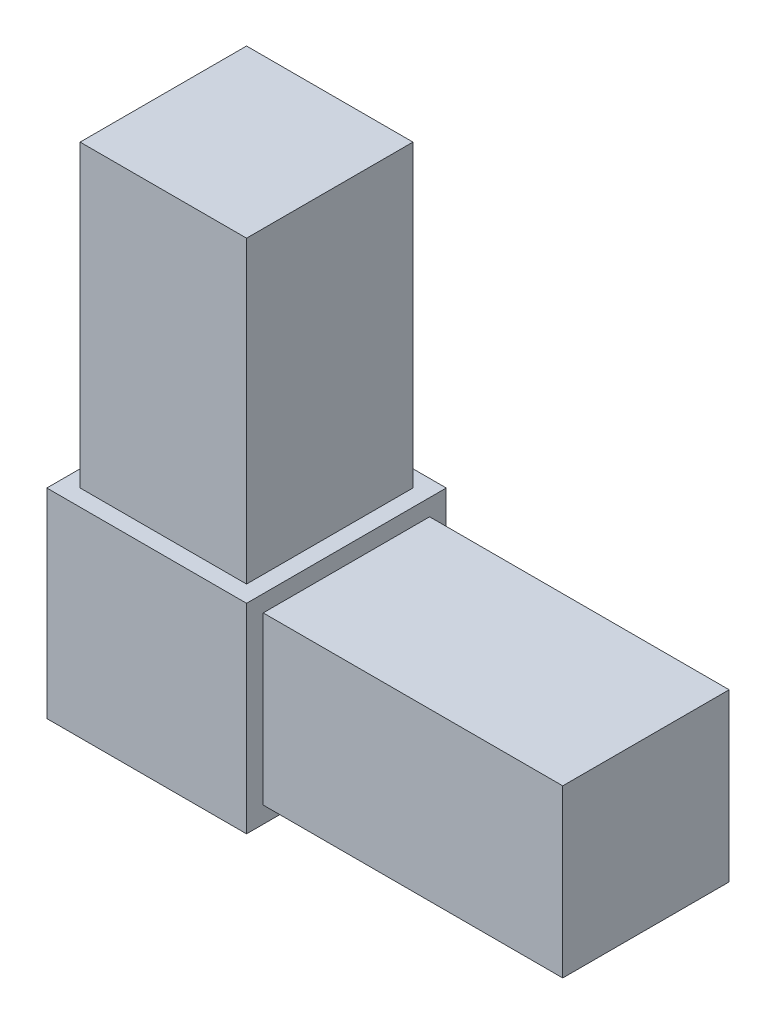
ISO-10303-21;
HEADER;
FILE_DESCRIPTION(('STEP AP214'),'2;1');
FILE_NAME('part.step','',(''),(''),'','','');
FILE_SCHEMA(('AUTOMOTIVE_DESIGN { 1 0 10303 214 1 1 1 1 }'));
ENDSEC;
DATA;
#1=APPLICATION_CONTEXT('core data for automotive mechanical design processes');
#2=APPLICATION_PROTOCOL_DEFINITION('international standard','automotive_design',2000,#1);
#3=PRODUCT_CONTEXT('',#1,'mechanical');
#4=PRODUCT('Part','Part','',(#3));
#5=PRODUCT_RELATED_PRODUCT_CATEGORY('part','',(#4));
#6=PRODUCT_DEFINITION_FORMATION('','',#4);
#7=PRODUCT_DEFINITION_CONTEXT('part definition',#1,'design');
#8=PRODUCT_DEFINITION('design','',#6,#7);
#9=PRODUCT_DEFINITION_SHAPE('','',#8);
#10=(LENGTH_UNIT() NAMED_UNIT(*) SI_UNIT(.MILLI.,.METRE.));
#11=(NAMED_UNIT(*) PLANE_ANGLE_UNIT() SI_UNIT($,.RADIAN.));
#12=(NAMED_UNIT(*) SI_UNIT($,.STERADIAN.) SOLID_ANGLE_UNIT());
#13=UNCERTAINTY_MEASURE_WITH_UNIT(LENGTH_MEASURE(1.E-05),#10,'distance_accuracy_value','');
#14=(GEOMETRIC_REPRESENTATION_CONTEXT(3) GLOBAL_UNCERTAINTY_ASSIGNED_CONTEXT((#13)) GLOBAL_UNIT_ASSIGNED_CONTEXT((#10,
#11,#12)) REPRESENTATION_CONTEXT('',''));
#15=CARTESIAN_POINT('',(0.,0.,0.));
#16=DIRECTION('',(0.,0.,1.));
#17=DIRECTION('',(1.,0.,0.));
#18=AXIS2_PLACEMENT_3D('',#15,#16,#17);
#19=CARTESIAN_POINT('',(9.525,-9.525,19.05));
#20=DIRECTION('',(-1.,0.,0.));
#21=DIRECTION('',(0.,0.,1.));
#22=AXIS2_PLACEMENT_3D('',#19,#20,#21);
#23=PLANE('',#22);
#24=DIRECTION('',(0.,1.,0.));
#25=VECTOR('',#24,1.);
#26=CARTESIAN_POINT('',(9.525,-9.525,0.));
#27=LINE('',#26,#25);
#28=CARTESIAN_POINT('',(9.525,-9.525,0.));
#29=VERTEX_POINT('',#28);
#30=CARTESIAN_POINT('',(9.525,9.525,0.));
#31=VERTEX_POINT('',#30);
#32=EDGE_CURVE('E198',#29,#31,#27,.T.);
#33=ORIENTED_EDGE('',*,*,#32,.T.);
#34=DIRECTION('',(0.,0.,-1.));
#35=VECTOR('',#34,1.);
#36=CARTESIAN_POINT('',(9.525,9.525,19.05));
#37=LINE('',#36,#35);
#38=CARTESIAN_POINT('',(9.525,9.525,19.05));
#39=VERTEX_POINT('',#38);
#40=EDGE_CURVE('E203',#39,#31,#37,.T.);
#41=ORIENTED_EDGE('',*,*,#40,.F.);
#42=DIRECTION('',(0.,1.,0.));
#43=VECTOR('',#42,1.);
#44=CARTESIAN_POINT('',(9.525,-9.525,19.05));
#45=LINE('',#44,#43);
#46=CARTESIAN_POINT('',(9.525,-9.525,19.05));
#47=VERTEX_POINT('',#46);
#48=EDGE_CURVE('E189',#47,#39,#45,.T.);
#49=ORIENTED_EDGE('',*,*,#48,.F.);
#50=DIRECTION('',(0.,0.,-1.));
#51=VECTOR('',#50,1.);
#52=CARTESIAN_POINT('',(9.525,-9.525,19.05));
#53=LINE('',#52,#51);
#54=EDGE_CURVE('E42',#47,#29,#53,.T.);
#55=ORIENTED_EDGE('',*,*,#54,.T.);
#56=EDGE_LOOP('',(#33,#41,#49,#55));
#57=FACE_BOUND('',#56,.T.);
#58=DIRECTION('',(0.,1.,0.));
#59=VECTOR('',#58,1.);
#60=CARTESIAN_POINT('',(9.525,-7.9375,1.5875));
#61=LINE('',#60,#59);
#62=CARTESIAN_POINT('',(9.525,-7.9375,1.5875));
#63=VERTEX_POINT('',#62);
#64=CARTESIAN_POINT('',(9.525,7.9375,1.5875));
#65=VERTEX_POINT('',#64);
#66=EDGE_CURVE('E143',#63,#65,#61,.T.);
#67=ORIENTED_EDGE('',*,*,#66,.F.);
#68=DIRECTION('',(0.,0.,-1.));
#69=VECTOR('',#68,1.);
#70=CARTESIAN_POINT('',(9.525,-7.9375,17.4625));
#71=LINE('',#70,#69);
#72=CARTESIAN_POINT('',(9.525,-7.9375,17.4625));
#73=VERTEX_POINT('',#72);
#74=EDGE_CURVE('E140',#73,#63,#71,.T.);
#75=ORIENTED_EDGE('',*,*,#74,.F.);
#76=DIRECTION('',(0.,-1.,0.));
#77=VECTOR('',#76,1.);
#78=CARTESIAN_POINT('',(9.525,-7.9375,17.4625));
#79=LINE('',#78,#77);
#80=CARTESIAN_POINT('',(9.525,7.9375,17.4625));
#81=VERTEX_POINT('',#80);
#82=EDGE_CURVE('E54',#81,#73,#79,.T.);
#83=ORIENTED_EDGE('',*,*,#82,.F.);
#84=DIRECTION('',(0.,0.,1.));
#85=VECTOR('',#84,1.);
#86=CARTESIAN_POINT('',(9.525,7.9375,17.4625));
#87=LINE('',#86,#85);
#88=EDGE_CURVE('E49',#65,#81,#87,.T.);
#89=ORIENTED_EDGE('',*,*,#88,.F.);
#90=EDGE_LOOP('',(#67,#75,#83,#89));
#91=FACE_BOUND('',#90,.T.);
#92=ADVANCED_FACE('F34',(#57,#91),#23,.F.);
#93=CARTESIAN_POINT('',(9.525,9.525,19.05));
#94=DIRECTION('',(0.,-1.,0.));
#95=DIRECTION('',(1.,0.,0.));
#96=AXIS2_PLACEMENT_3D('',#93,#94,#95);
#97=PLANE('',#96);
#98=DIRECTION('',(-1.,0.,0.));
#99=VECTOR('',#98,1.);
#100=CARTESIAN_POINT('',(9.525,9.525,0.));
#101=LINE('',#100,#99);
#102=CARTESIAN_POINT('',(-9.525,9.525,0.));
#103=VERTEX_POINT('',#102);
#104=EDGE_CURVE('E187',#31,#103,#101,.T.);
#105=ORIENTED_EDGE('',*,*,#104,.T.);
#106=DIRECTION('',(0.,0.,-1.));
#107=VECTOR('',#106,1.);
#108=CARTESIAN_POINT('',(-9.525,9.525,19.05));
#109=LINE('',#108,#107);
#110=CARTESIAN_POINT('',(-9.525,9.525,19.05));
#111=VERTEX_POINT('',#110);
#112=EDGE_CURVE('E193',#111,#103,#109,.T.);
#113=ORIENTED_EDGE('',*,*,#112,.F.);
#114=DIRECTION('',(-1.,0.,0.));
#115=VECTOR('',#114,1.);
#116=CARTESIAN_POINT('',(9.525,9.525,19.05));
#117=LINE('',#116,#115);
#118=EDGE_CURVE('E191',#39,#111,#117,.T.);
#119=ORIENTED_EDGE('',*,*,#118,.F.);
#120=ORIENTED_EDGE('',*,*,#40,.T.);
#121=EDGE_LOOP('',(#105,#113,#119,#120));
#122=FACE_BOUND('',#121,.T.);
#123=DIRECTION('',(0.,0.,-1.));
#124=VECTOR('',#123,1.);
#125=CARTESIAN_POINT('',(7.9375,9.525,1.5875));
#126=LINE('',#125,#124);
#127=CARTESIAN_POINT('',(7.9375,9.525,17.4625));
#128=VERTEX_POINT('',#127);
#129=CARTESIAN_POINT('',(7.9375,9.525,1.5875));
#130=VERTEX_POINT('',#129);
#131=EDGE_CURVE('E144',#128,#130,#126,.T.);
#132=ORIENTED_EDGE('',*,*,#131,.F.);
#133=DIRECTION('',(1.,0.,0.));
#134=VECTOR('',#133,1.);
#135=CARTESIAN_POINT('',(-7.9375,9.525,17.4625));
#136=LINE('',#135,#134);
#137=CARTESIAN_POINT('',(-7.9375,9.525,17.4625));
#138=VERTEX_POINT('',#137);
#139=EDGE_CURVE('E157',#138,#128,#136,.T.);
#140=ORIENTED_EDGE('',*,*,#139,.F.);
#141=DIRECTION('',(0.,0.,1.));
#142=VECTOR('',#141,1.);
#143=CARTESIAN_POINT('',(-7.9375,9.525,1.5875));
#144=LINE('',#143,#142);
#145=CARTESIAN_POINT('',(-7.9375,9.525,1.58750000000001));
#146=VERTEX_POINT('',#145);
#147=EDGE_CURVE('E166',#146,#138,#144,.T.);
#148=ORIENTED_EDGE('',*,*,#147,.F.);
#149=DIRECTION('',(-1.,0.,0.));
#150=VECTOR('',#149,1.);
#151=CARTESIAN_POINT('',(-7.9375,9.525,1.5875));
#152=LINE('',#151,#150);
#153=EDGE_CURVE('E147',#130,#146,#152,.T.);
#154=ORIENTED_EDGE('',*,*,#153,.F.);
#155=EDGE_LOOP('',(#132,#140,#148,#154));
#156=FACE_BOUND('',#155,.T.);
#157=ADVANCED_FACE('F218',(#122,#156),#97,.F.);
#158=CARTESIAN_POINT('',(-9.525,-9.525,19.05));
#159=DIRECTION('',(1.,0.,0.));
#160=DIRECTION('',(0.,0.,-1.));
#161=AXIS2_PLACEMENT_3D('',#158,#159,#160);
#162=PLANE('',#161);
#163=DIRECTION('',(0.,-1.,0.));
#164=VECTOR('',#163,1.);
#165=CARTESIAN_POINT('',(-9.525,-9.525,0.));
#166=LINE('',#165,#164);
#167=CARTESIAN_POINT('',(-9.525,-9.525,0.));
#168=VERTEX_POINT('',#167);
#169=EDGE_CURVE('E182',#103,#168,#166,.T.);
#170=ORIENTED_EDGE('',*,*,#169,.T.);
#171=DIRECTION('',(0.,0.,-1.));
#172=VECTOR('',#171,1.);
#173=CARTESIAN_POINT('',(-9.525,-9.525,19.05));
#174=LINE('',#173,#172);
#175=CARTESIAN_POINT('',(-9.525,-9.525,19.05));
#176=VERTEX_POINT('',#175);
#177=EDGE_CURVE('E11',#176,#168,#174,.T.);
#178=ORIENTED_EDGE('',*,*,#177,.F.);
#179=DIRECTION('',(0.,-1.,0.));
#180=VECTOR('',#179,1.);
#181=CARTESIAN_POINT('',(-9.525,-9.525,19.05));
#182=LINE('',#181,#180);
#183=EDGE_CURVE('E183',#111,#176,#182,.T.);
#184=ORIENTED_EDGE('',*,*,#183,.F.);
#185=ORIENTED_EDGE('',*,*,#112,.T.);
#186=EDGE_LOOP('',(#170,#178,#184,#185));
#187=FACE_BOUND('',#186,.T.);
#188=ADVANCED_FACE('F36',(#187),#162,.F.);
#189=CARTESIAN_POINT('',(9.525,-9.525,19.05));
#190=DIRECTION('',(0.,1.,0.));
#191=DIRECTION('',(-1.,0.,0.));
#192=AXIS2_PLACEMENT_3D('',#189,#190,#191);
#193=PLANE('',#192);
#194=DIRECTION('',(1.,0.,0.));
#195=VECTOR('',#194,1.);
#196=CARTESIAN_POINT('',(9.525,-9.525,0.));
#197=LINE('',#196,#195);
#198=EDGE_CURVE('E196',#168,#29,#197,.T.);
#199=ORIENTED_EDGE('',*,*,#198,.T.);
#200=ORIENTED_EDGE('',*,*,#54,.F.);
#201=DIRECTION('',(1.,0.,0.));
#202=VECTOR('',#201,1.);
#203=CARTESIAN_POINT('',(9.525,-9.525,19.05));
#204=LINE('',#203,#202);
#205=EDGE_CURVE('E186',#176,#47,#204,.T.);
#206=ORIENTED_EDGE('',*,*,#205,.F.);
#207=ORIENTED_EDGE('',*,*,#177,.T.);
#208=EDGE_LOOP('',(#199,#200,#206,#207));
#209=FACE_BOUND('',#208,.T.);
#210=ADVANCED_FACE('F226',(#209),#193,.F.);
#211=CARTESIAN_POINT('',(0.,0.,19.05));
#212=DIRECTION('',(0.,0.,1.));
#213=DIRECTION('',(1.,0.,0.));
#214=AXIS2_PLACEMENT_3D('',#211,#212,#213);
#215=PLANE('',#214);
#216=ORIENTED_EDGE('',*,*,#183,.T.);
#217=ORIENTED_EDGE('',*,*,#205,.T.);
#218=ORIENTED_EDGE('',*,*,#48,.T.);
#219=ORIENTED_EDGE('',*,*,#118,.T.);
#220=EDGE_LOOP('',(#216,#217,#218,#219));
#221=FACE_BOUND('',#220,.T.);
#222=ADVANCED_FACE('F225',(#221),#215,.T.);
#223=CARTESIAN_POINT('',(0.,0.,0.));
#224=DIRECTION('',(0.,0.,1.));
#225=DIRECTION('',(1.,0.,0.));
#226=AXIS2_PLACEMENT_3D('',#223,#224,#225);
#227=PLANE('',#226);
#228=ORIENTED_EDGE('',*,*,#169,.F.);
#229=ORIENTED_EDGE('',*,*,#104,.F.);
#230=ORIENTED_EDGE('',*,*,#32,.F.);
#231=ORIENTED_EDGE('',*,*,#198,.F.);
#232=EDGE_LOOP('',(#228,#229,#230,#231));
#233=FACE_BOUND('',#232,.T.);
#234=ADVANCED_FACE('F215',(#233),#227,.F.);
#235=CARTESIAN_POINT('',(7.9375,38.1,1.5875));
#236=DIRECTION('',(-1.,0.,0.));
#237=DIRECTION('',(0.,0.,1.));
#238=AXIS2_PLACEMENT_3D('',#235,#236,#237);
#239=PLANE('',#238);
#240=ORIENTED_EDGE('',*,*,#131,.T.);
#241=DIRECTION('',(0.,-1.,0.));
#242=VECTOR('',#241,1.);
#243=CARTESIAN_POINT('',(7.9375,38.1,1.5875));
#244=LINE('',#243,#242);
#245=CARTESIAN_POINT('',(7.9375,38.1,1.5875));
#246=VERTEX_POINT('',#245);
#247=EDGE_CURVE('E179',#246,#130,#244,.T.);
#248=ORIENTED_EDGE('',*,*,#247,.F.);
#249=DIRECTION('',(0.,0.,-1.));
#250=VECTOR('',#249,1.);
#251=CARTESIAN_POINT('',(7.9375,38.1,1.5875));
#252=LINE('',#251,#250);
#253=CARTESIAN_POINT('',(7.9375,38.1,17.4625));
#254=VERTEX_POINT('',#253);
#255=EDGE_CURVE('E153',#254,#246,#252,.T.);
#256=ORIENTED_EDGE('',*,*,#255,.F.);
#257=DIRECTION('',(0.,-1.,0.));
#258=VECTOR('',#257,1.);
#259=CARTESIAN_POINT('',(7.9375,38.1,17.4625));
#260=LINE('',#259,#258);
#261=EDGE_CURVE('E162',#254,#128,#260,.T.);
#262=ORIENTED_EDGE('',*,*,#261,.T.);
#263=EDGE_LOOP('',(#240,#248,#256,#262));
#264=FACE_BOUND('',#263,.T.);
#265=ADVANCED_FACE('F241',(#264),#239,.F.);
#266=CARTESIAN_POINT('',(-7.9375,38.1,1.5875));
#267=DIRECTION('',(0.,0.,1.));
#268=DIRECTION('',(1.,0.,0.));
#269=AXIS2_PLACEMENT_3D('',#266,#267,#268);
#270=PLANE('',#269);
#271=ORIENTED_EDGE('',*,*,#153,.T.);
#272=DIRECTION('',(0.,-1.,0.));
#273=VECTOR('',#272,1.);
#274=CARTESIAN_POINT('',(-7.9375,38.1,1.5875));
#275=LINE('',#274,#273);
#276=CARTESIAN_POINT('',(-7.9375,38.1,1.5875));
#277=VERTEX_POINT('',#276);
#278=EDGE_CURVE('E176',#277,#146,#275,.T.);
#279=ORIENTED_EDGE('',*,*,#278,.F.);
#280=DIRECTION('',(-1.,0.,0.));
#281=VECTOR('',#280,1.);
#282=CARTESIAN_POINT('',(-7.9375,38.1,1.5875));
#283=LINE('',#282,#281);
#284=EDGE_CURVE('E156',#246,#277,#283,.T.);
#285=ORIENTED_EDGE('',*,*,#284,.F.);
#286=ORIENTED_EDGE('',*,*,#247,.T.);
#287=EDGE_LOOP('',(#271,#279,#285,#286));
#288=FACE_BOUND('',#287,.T.);
#289=ADVANCED_FACE('F245',(#288),#270,.F.);
#290=CARTESIAN_POINT('',(-7.9375,38.1,1.5875));
#291=DIRECTION('',(1.,0.,0.));
#292=DIRECTION('',(0.,0.,-1.));
#293=AXIS2_PLACEMENT_3D('',#290,#291,#292);
#294=PLANE('',#293);
#295=ORIENTED_EDGE('',*,*,#147,.T.);
#296=DIRECTION('',(0.,-1.,0.));
#297=VECTOR('',#296,1.);
#298=CARTESIAN_POINT('',(-7.9375,38.1,17.4625));
#299=LINE('',#298,#297);
#300=CARTESIAN_POINT('',(-7.9375,38.1,17.4625));
#301=VERTEX_POINT('',#300);
#302=EDGE_CURVE('E173',#301,#138,#299,.T.);
#303=ORIENTED_EDGE('',*,*,#302,.F.);
#304=DIRECTION('',(0.,0.,1.));
#305=VECTOR('',#304,1.);
#306=CARTESIAN_POINT('',(-7.9375,38.1,1.5875));
#307=LINE('',#306,#305);
#308=EDGE_CURVE('E159',#277,#301,#307,.T.);
#309=ORIENTED_EDGE('',*,*,#308,.F.);
#310=ORIENTED_EDGE('',*,*,#278,.T.);
#311=EDGE_LOOP('',(#295,#303,#309,#310));
#312=FACE_BOUND('',#311,.T.);
#313=ADVANCED_FACE('F249',(#312),#294,.F.);
#314=CARTESIAN_POINT('',(-7.9375,38.1,17.4625));
#315=DIRECTION('',(0.,0.,-1.));
#316=DIRECTION('',(-1.,0.,0.));
#317=AXIS2_PLACEMENT_3D('',#314,#315,#316);
#318=PLANE('',#317);
#319=ORIENTED_EDGE('',*,*,#139,.T.);
#320=ORIENTED_EDGE('',*,*,#261,.F.);
#321=DIRECTION('',(1.,0.,0.));
#322=VECTOR('',#321,1.);
#323=CARTESIAN_POINT('',(-7.9375,38.1,17.4625));
#324=LINE('',#323,#322);
#325=EDGE_CURVE('E161',#301,#254,#324,.T.);
#326=ORIENTED_EDGE('',*,*,#325,.F.);
#327=ORIENTED_EDGE('',*,*,#302,.T.);
#328=EDGE_LOOP('',(#319,#320,#326,#327));
#329=FACE_BOUND('',#328,.T.);
#330=ADVANCED_FACE('F253',(#329),#318,.F.);
#331=CARTESIAN_POINT('',(0.,38.1,0.));
#332=DIRECTION('',(0.,1.,0.));
#333=DIRECTION('',(0.,0.,1.));
#334=AXIS2_PLACEMENT_3D('',#331,#332,#333);
#335=PLANE('',#334);
#336=ORIENTED_EDGE('',*,*,#255,.T.);
#337=ORIENTED_EDGE('',*,*,#284,.T.);
#338=ORIENTED_EDGE('',*,*,#308,.T.);
#339=ORIENTED_EDGE('',*,*,#325,.T.);
#340=EDGE_LOOP('',(#336,#337,#338,#339));
#341=FACE_BOUND('',#340,.T.);
#342=ADVANCED_FACE('F257',(#341),#335,.T.);
#343=CARTESIAN_POINT('',(38.1,-7.9375,1.5875));
#344=DIRECTION('',(0.,0.,1.));
#345=DIRECTION('',(1.,0.,0.));
#346=AXIS2_PLACEMENT_3D('',#343,#344,#345);
#347=PLANE('',#346);
#348=ORIENTED_EDGE('',*,*,#66,.T.);
#349=DIRECTION('',(-1.,0.,0.));
#350=VECTOR('',#349,1.);
#351=CARTESIAN_POINT('',(38.1,7.9375,1.5875));
#352=LINE('',#351,#350);
#353=CARTESIAN_POINT('',(38.1,7.9375,1.5875));
#354=VERTEX_POINT('',#353);
#355=EDGE_CURVE('E124',#354,#65,#352,.T.);
#356=ORIENTED_EDGE('',*,*,#355,.F.);
#357=DIRECTION('',(0.,1.,0.));
#358=VECTOR('',#357,1.);
#359=CARTESIAN_POINT('',(38.1,-7.9375,1.5875));
#360=LINE('',#359,#358);
#361=CARTESIAN_POINT('',(38.1,-7.9375,1.5875));
#362=VERTEX_POINT('',#361);
#363=EDGE_CURVE('E131',#362,#354,#360,.T.);
#364=ORIENTED_EDGE('',*,*,#363,.F.);
#365=DIRECTION('',(-1.,0.,0.));
#366=VECTOR('',#365,1.);
#367=CARTESIAN_POINT('',(38.1,-7.9375,1.5875));
#368=LINE('',#367,#366);
#369=EDGE_CURVE('E369',#362,#63,#368,.T.);
#370=ORIENTED_EDGE('',*,*,#369,.T.);
#371=EDGE_LOOP('',(#348,#356,#364,#370));
#372=FACE_BOUND('',#371,.T.);
#373=ADVANCED_FACE('F142',(#372),#347,.F.);
#374=CARTESIAN_POINT('',(38.1,7.9375,17.4625));
#375=DIRECTION('',(0.,-1.,0.));
#376=DIRECTION('',(0.,0.,-1.));
#377=AXIS2_PLACEMENT_3D('',#374,#375,#376);
#378=PLANE('',#377);
#379=ORIENTED_EDGE('',*,*,#88,.T.);
#380=DIRECTION('',(-1.,0.,0.));
#381=VECTOR('',#380,1.);
#382=CARTESIAN_POINT('',(38.1,7.9375,17.4625));
#383=LINE('',#382,#381);
#384=CARTESIAN_POINT('',(38.1,7.9375,17.4625));
#385=VERTEX_POINT('',#384);
#386=EDGE_CURVE('E127',#385,#81,#383,.T.);
#387=ORIENTED_EDGE('',*,*,#386,.F.);
#388=DIRECTION('',(0.,0.,1.));
#389=VECTOR('',#388,1.);
#390=CARTESIAN_POINT('',(38.1,7.9375,17.4625));
#391=LINE('',#390,#389);
#392=EDGE_CURVE('E120',#354,#385,#391,.T.);
#393=ORIENTED_EDGE('',*,*,#392,.F.);
#394=ORIENTED_EDGE('',*,*,#355,.T.);
#395=EDGE_LOOP('',(#379,#387,#393,#394));
#396=FACE_BOUND('',#395,.T.);
#397=ADVANCED_FACE('F122',(#396),#378,.F.);
#398=CARTESIAN_POINT('',(38.1,-7.9375,17.4625));
#399=DIRECTION('',(0.,0.,-1.));
#400=DIRECTION('',(-1.,0.,0.));
#401=AXIS2_PLACEMENT_3D('',#398,#399,#400);
#402=PLANE('',#401);
#403=ORIENTED_EDGE('',*,*,#82,.T.);
#404=DIRECTION('',(-1.,0.,0.));
#405=VECTOR('',#404,1.);
#406=CARTESIAN_POINT('',(38.1,-7.9375,17.4625));
#407=LINE('',#406,#405);
#408=CARTESIAN_POINT('',(38.1,-7.9375,17.4625));
#409=VERTEX_POINT('',#408);
#410=EDGE_CURVE('E149',#409,#73,#407,.T.);
#411=ORIENTED_EDGE('',*,*,#410,.F.);
#412=DIRECTION('',(0.,-1.,0.));
#413=VECTOR('',#412,1.);
#414=CARTESIAN_POINT('',(38.1,-7.9375,17.4625));
#415=LINE('',#414,#413);
#416=EDGE_CURVE('E130',#385,#409,#415,.T.);
#417=ORIENTED_EDGE('',*,*,#416,.F.);
#418=ORIENTED_EDGE('',*,*,#386,.T.);
#419=EDGE_LOOP('',(#403,#411,#417,#418));
#420=FACE_BOUND('',#419,.T.);
#421=ADVANCED_FACE('F266',(#420),#402,.F.);
#422=CARTESIAN_POINT('',(38.1,-7.9375,17.4625));
#423=DIRECTION('',(0.,1.,0.));
#424=DIRECTION('',(0.,0.,1.));
#425=AXIS2_PLACEMENT_3D('',#422,#423,#424);
#426=PLANE('',#425);
#427=ORIENTED_EDGE('',*,*,#74,.T.);
#428=ORIENTED_EDGE('',*,*,#369,.F.);
#429=DIRECTION('',(0.,0.,-1.));
#430=VECTOR('',#429,1.);
#431=CARTESIAN_POINT('',(38.1,-7.9375,17.4625));
#432=LINE('',#431,#430);
#433=EDGE_CURVE('E136',#409,#362,#432,.T.);
#434=ORIENTED_EDGE('',*,*,#433,.F.);
#435=ORIENTED_EDGE('',*,*,#410,.T.);
#436=EDGE_LOOP('',(#427,#428,#434,#435));
#437=FACE_BOUND('',#436,.T.);
#438=ADVANCED_FACE('F269',(#437),#426,.F.);
#439=CARTESIAN_POINT('',(38.1,0.,0.));
#440=DIRECTION('',(-1.,0.,0.));
#441=DIRECTION('',(0.,0.,1.));
#442=AXIS2_PLACEMENT_3D('',#439,#440,#441);
#443=PLANE('',#442);
#444=ORIENTED_EDGE('',*,*,#363,.T.);
#445=ORIENTED_EDGE('',*,*,#392,.T.);
#446=ORIENTED_EDGE('',*,*,#416,.T.);
#447=ORIENTED_EDGE('',*,*,#433,.T.);
#448=EDGE_LOOP('',(#444,#445,#446,#447));
#449=FACE_BOUND('',#448,.T.);
#450=ADVANCED_FACE('F134',(#449),#443,.F.);
#451=CLOSED_SHELL('',(#92,#157,#188,#210,#222,#234,#265,#289,#313,#330,#342,#373,#397,#421,#438,#450));
#452=MANIFOLD_SOLID_BREP('B2',#451);
#453=ADVANCED_BREP_SHAPE_REPRESENTATION('',(#18,#452),#14);
#454=SHAPE_DEFINITION_REPRESENTATION(#9,#453);
ENDSEC;
END-ISO-10303-21;
